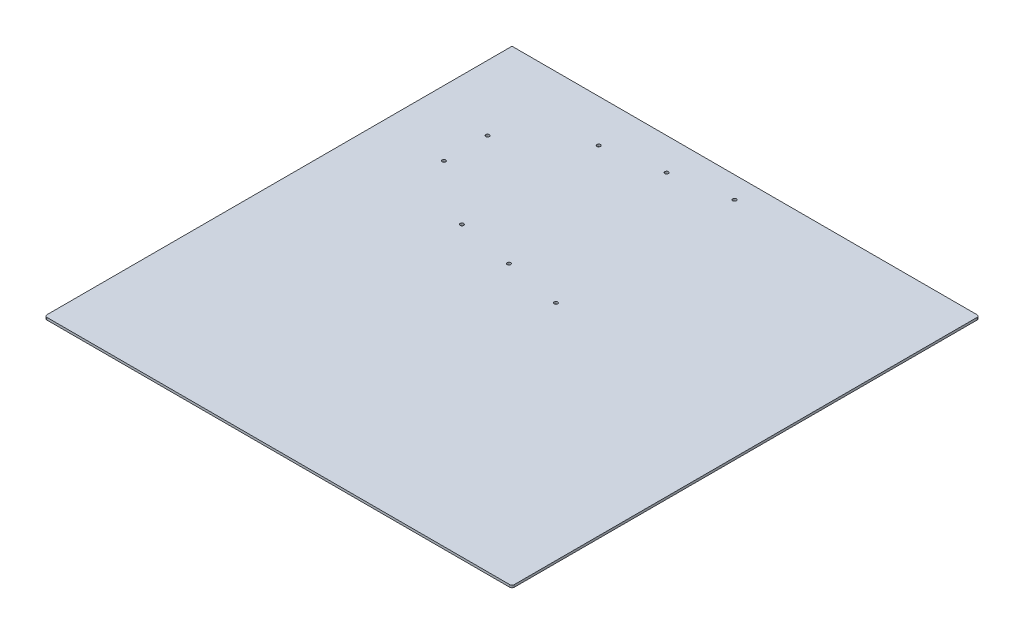
ISO-10303-21;
HEADER;
FILE_DESCRIPTION(('STEP AP214'),'2;1');
FILE_NAME('part.step','',(''),(''),'','','');
FILE_SCHEMA(('AUTOMOTIVE_DESIGN { 1 0 10303 214 1 1 1 1 }'));
ENDSEC;
DATA;
#1=APPLICATION_CONTEXT('core data for automotive mechanical design processes');
#2=APPLICATION_PROTOCOL_DEFINITION('international standard','automotive_design',2000,#1);
#3=PRODUCT_CONTEXT('',#1,'mechanical');
#4=PRODUCT('Part','Part','',(#3));
#5=PRODUCT_RELATED_PRODUCT_CATEGORY('part','',(#4));
#6=PRODUCT_DEFINITION_FORMATION('','',#4);
#7=PRODUCT_DEFINITION_CONTEXT('part definition',#1,'design');
#8=PRODUCT_DEFINITION('design','',#6,#7);
#9=PRODUCT_DEFINITION_SHAPE('','',#8);
#10=(LENGTH_UNIT() NAMED_UNIT(*) SI_UNIT(.MILLI.,.METRE.));
#11=(NAMED_UNIT(*) PLANE_ANGLE_UNIT() SI_UNIT($,.RADIAN.));
#12=(NAMED_UNIT(*) SI_UNIT($,.STERADIAN.) SOLID_ANGLE_UNIT());
#13=UNCERTAINTY_MEASURE_WITH_UNIT(LENGTH_MEASURE(1.E-05),#10,'distance_accuracy_value','');
#14=(GEOMETRIC_REPRESENTATION_CONTEXT(3) GLOBAL_UNCERTAINTY_ASSIGNED_CONTEXT((#13)) GLOBAL_UNIT_ASSIGNED_CONTEXT((#10,
#11,#12)) REPRESENTATION_CONTEXT('',''));
#15=CARTESIAN_POINT('',(0.,0.,0.));
#16=DIRECTION('',(0.,0.,1.));
#17=DIRECTION('',(1.,0.,0.));
#18=AXIS2_PLACEMENT_3D('',#15,#16,#17);
#19=CARTESIAN_POINT('',(0.,0.,0.));
#20=DIRECTION('',(0.,1.,0.));
#21=DIRECTION('',(1.,0.,0.));
#22=AXIS2_PLACEMENT_3D('',#19,#20,#21);
#23=PLANE('',#22);
#24=CARTESIAN_POINT('',(-40.1473556261201,0.,-37.5240841158934));
#25=DIRECTION('',(0.,1.,0.));
#26=DIRECTION('',(1.,0.,0.));
#27=AXIS2_PLACEMENT_3D('',#24,#25,#26);
#28=CIRCLE('',#27,1.5);
#29=CARTESIAN_POINT('',(-41.6473556261201,0.,-37.5240841158934));
#30=VERTEX_POINT('',#29);
#31=EDGE_CURVE('E21',#30,#30,#28,.T.);
#32=ORIENTED_EDGE('',*,*,#31,.T.);
#33=EDGE_LOOP('',(#32));
#34=FACE_BOUND('',#33,.T.);
#35=CARTESIAN_POINT('',(-144.179839264374,0.,-123.344131154265));
#36=DIRECTION('',(0.,1.,0.));
#37=DIRECTION('',(1.,0.,0.));
#38=AXIS2_PLACEMENT_3D('',#35,#36,#37);
#39=CIRCLE('',#38,1.5);
#40=CARTESIAN_POINT('',(-145.679839264374,0.,-123.344131154265));
#41=VERTEX_POINT('',#40);
#42=EDGE_CURVE('E228',#41,#41,#39,.T.);
#43=ORIENTED_EDGE('',*,*,#42,.T.);
#44=EDGE_LOOP('',(#43));
#45=FACE_BOUND('',#44,.T.);
#46=CARTESIAN_POINT('',(-89.3419163550637,0.,-163.537504689386));
#47=DIRECTION('',(0.,1.,0.));
#48=DIRECTION('',(1.,0.,0.));
#49=AXIS2_PLACEMENT_3D('',#46,#47,#48);
#50=CIRCLE('',#49,1.5);
#51=CARTESIAN_POINT('',(-90.8419163550637,0.,-163.537504689386));
#52=VERTEX_POINT('',#51);
#53=EDGE_CURVE('E273',#52,#52,#50,.T.);
#54=ORIENTED_EDGE('',*,*,#53,.T.);
#55=EDGE_LOOP('',(#54));
#56=FACE_BOUND('',#55,.T.);
#57=CARTESIAN_POINT('',(-144.179839264374,0.,-85.8946819714881));
#58=DIRECTION('',(0.,1.,0.));
#59=DIRECTION('',(1.,0.,0.));
#60=AXIS2_PLACEMENT_3D('',#57,#58,#59);
#61=CIRCLE('',#60,1.5);
#62=CARTESIAN_POINT('',(-145.679839264374,0.,-85.8946819714881));
#63=VERTEX_POINT('',#62);
#64=EDGE_CURVE('E191',#63,#63,#61,.T.);
#65=ORIENTED_EDGE('',*,*,#64,.T.);
#66=EDGE_LOOP('',(#65));
#67=FACE_BOUND('',#66,.T.);
#68=CARTESIAN_POINT('',(9.04720510282539,0.,-28.5856729211623));
#69=DIRECTION('',(0.,1.,0.));
#70=DIRECTION('',(1.,0.,0.));
#71=AXIS2_PLACEMENT_3D('',#68,#69,#70);
#72=CIRCLE('',#71,1.5);
#73=CARTESIAN_POINT('',(7.54720510282541,0.,-28.5856729211623));
#74=VERTEX_POINT('',#73);
#75=EDGE_CURVE('E197',#74,#74,#72,.T.);
#76=ORIENTED_EDGE('',*,*,#75,.T.);
#77=EDGE_LOOP('',(#76));
#78=FACE_BOUND('',#77,.T.);
#79=CARTESIAN_POINT('',(-40.1473556261179,0.,-172.475915884116));
#80=DIRECTION('',(0.,1.,0.));
#81=DIRECTION('',(1.,0.,0.));
#82=AXIS2_PLACEMENT_3D('',#79,#80,#81);
#83=CIRCLE('',#82,1.5);
#84=CARTESIAN_POINT('',(-41.6473556261179,0.,-172.475915884116));
#85=VERTEX_POINT('',#84);
#86=EDGE_CURVE('E227',#85,#85,#83,.T.);
#87=ORIENTED_EDGE('',*,*,#86,.T.);
#88=EDGE_LOOP('',(#87));
#89=FACE_BOUND('',#88,.T.);
#90=CARTESIAN_POINT('',(9.04720510282782,0.,-181.414327078845));
#91=DIRECTION('',(0.,1.,0.));
#92=DIRECTION('',(1.,0.,0.));
#93=AXIS2_PLACEMENT_3D('',#90,#91,#92);
#94=CIRCLE('',#93,1.5);
#95=CARTESIAN_POINT('',(7.54720510282784,0.,-181.414327078845));
#96=VERTEX_POINT('',#95);
#97=EDGE_CURVE('E152',#96,#96,#94,.T.);
#98=ORIENTED_EDGE('',*,*,#97,.T.);
#99=EDGE_LOOP('',(#98));
#100=FACE_BOUND('',#99,.T.);
#101=CARTESIAN_POINT('',(-89.3419163550656,0.,-46.4624953106245));
#102=DIRECTION('',(0.,1.,0.));
#103=DIRECTION('',(1.,0.,0.));
#104=AXIS2_PLACEMENT_3D('',#101,#102,#103);
#105=CIRCLE('',#104,1.5);
#106=CARTESIAN_POINT('',(-90.8419163550655,0.,-46.4624953106245));
#107=VERTEX_POINT('',#106);
#108=EDGE_CURVE('E223',#107,#107,#105,.T.);
#109=ORIENTED_EDGE('',*,*,#108,.T.);
#110=EDGE_LOOP('',(#109));
#111=FACE_BOUND('',#110,.T.);
#112=CARTESIAN_POINT('',(198.,0.,198.));
#113=DIRECTION('',(0.,1.,0.));
#114=DIRECTION('',(0.,0.,1.));
#115=AXIS2_PLACEMENT_3D('',#112,#113,#114);
#116=CIRCLE('',#115,2.);
#117=CARTESIAN_POINT('',(198.,0.,200.));
#118=VERTEX_POINT('',#117);
#119=CARTESIAN_POINT('',(200.,0.,198.));
#120=VERTEX_POINT('',#119);
#121=EDGE_CURVE('E28',#118,#120,#116,.T.);
#122=ORIENTED_EDGE('',*,*,#121,.F.);
#123=DIRECTION('',(1.,0.,0.));
#124=VECTOR('',#123,1.);
#125=CARTESIAN_POINT('',(-198.,0.,200.));
#126=LINE('',#125,#124);
#127=CARTESIAN_POINT('',(-198.,0.,200.));
#128=VERTEX_POINT('',#127);
#129=EDGE_CURVE('E298',#128,#118,#126,.T.);
#130=ORIENTED_EDGE('',*,*,#129,.F.);
#131=CARTESIAN_POINT('',(-198.,0.,198.));
#132=DIRECTION('',(0.,1.,0.));
#133=DIRECTION('',(-1.,0.,0.));
#134=AXIS2_PLACEMENT_3D('',#131,#132,#133);
#135=CIRCLE('',#134,2.00000000000006);
#136=CARTESIAN_POINT('',(-200.,0.,198.));
#137=VERTEX_POINT('',#136);
#138=EDGE_CURVE('E204',#137,#128,#135,.T.);
#139=ORIENTED_EDGE('',*,*,#138,.F.);
#140=DIRECTION('',(0.,0.,1.));
#141=VECTOR('',#140,1.);
#142=CARTESIAN_POINT('',(-200.,0.,-200.));
#143=LINE('',#142,#141);
#144=CARTESIAN_POINT('',(-200.,0.,-200.));
#145=VERTEX_POINT('',#144);
#146=EDGE_CURVE('E201',#145,#137,#143,.T.);
#147=ORIENTED_EDGE('',*,*,#146,.F.);
#148=DIRECTION('',(-1.,0.,0.));
#149=VECTOR('',#148,1.);
#150=CARTESIAN_POINT('',(198.,0.,-200.));
#151=LINE('',#150,#149);
#152=CARTESIAN_POINT('',(198.,0.,-200.));
#153=VERTEX_POINT('',#152);
#154=EDGE_CURVE('E239',#153,#145,#151,.T.);
#155=ORIENTED_EDGE('',*,*,#154,.F.);
#156=CARTESIAN_POINT('',(198.,0.,-198.));
#157=DIRECTION('',(0.,1.,0.));
#158=DIRECTION('',(1.,0.,0.));
#159=AXIS2_PLACEMENT_3D('',#156,#157,#158);
#160=CIRCLE('',#159,2.);
#161=CARTESIAN_POINT('',(200.,0.,-198.));
#162=VERTEX_POINT('',#161);
#163=EDGE_CURVE('E186',#162,#153,#160,.T.);
#164=ORIENTED_EDGE('',*,*,#163,.F.);
#165=DIRECTION('',(0.,0.,-1.));
#166=VECTOR('',#165,1.);
#167=CARTESIAN_POINT('',(200.,0.,198.));
#168=LINE('',#167,#166);
#169=EDGE_CURVE('E178',#120,#162,#168,.T.);
#170=ORIENTED_EDGE('',*,*,#169,.F.);
#171=EDGE_LOOP('',(#122,#130,#139,#147,#155,#164,#170));
#172=FACE_BOUND('',#171,.T.);
#173=ADVANCED_FACE('F17',(#34,#45,#56,#67,#78,#89,#100,#111,#172),#23,.F.);
#174=CARTESIAN_POINT('',(0.,2.,0.));
#175=DIRECTION('',(0.,1.,0.));
#176=DIRECTION('',(1.,0.,0.));
#177=AXIS2_PLACEMENT_3D('',#174,#175,#176);
#178=PLANE('',#177);
#179=CARTESIAN_POINT('',(-40.1473556261201,2.,-37.5240841158934));
#180=DIRECTION('',(0.,-1.,0.));
#181=DIRECTION('',(1.,0.,0.));
#182=AXIS2_PLACEMENT_3D('',#179,#180,#181);
#183=CIRCLE('',#182,1.5);
#184=CARTESIAN_POINT('',(-41.6473556261201,2.,-37.5240841158934));
#185=VERTEX_POINT('',#184);
#186=EDGE_CURVE('E231',#185,#185,#183,.T.);
#187=ORIENTED_EDGE('',*,*,#186,.T.);
#188=EDGE_LOOP('',(#187));
#189=FACE_BOUND('',#188,.T.);
#190=CARTESIAN_POINT('',(-144.179839264374,2.,-123.344131154265));
#191=DIRECTION('',(0.,-1.,0.));
#192=DIRECTION('',(1.,0.,0.));
#193=AXIS2_PLACEMENT_3D('',#190,#191,#192);
#194=CIRCLE('',#193,1.5);
#195=CARTESIAN_POINT('',(-145.679839264374,2.,-123.344131154265));
#196=VERTEX_POINT('',#195);
#197=EDGE_CURVE('E261',#196,#196,#194,.T.);
#198=ORIENTED_EDGE('',*,*,#197,.T.);
#199=EDGE_LOOP('',(#198));
#200=FACE_BOUND('',#199,.T.);
#201=CARTESIAN_POINT('',(-89.3419163550637,2.,-163.537504689386));
#202=DIRECTION('',(0.,-1.,0.));
#203=DIRECTION('',(1.,0.,0.));
#204=AXIS2_PLACEMENT_3D('',#201,#202,#203);
#205=CIRCLE('',#204,1.5);
#206=CARTESIAN_POINT('',(-90.8419163550637,2.,-163.537504689386));
#207=VERTEX_POINT('',#206);
#208=EDGE_CURVE('E187',#207,#207,#205,.T.);
#209=ORIENTED_EDGE('',*,*,#208,.T.);
#210=EDGE_LOOP('',(#209));
#211=FACE_BOUND('',#210,.T.);
#212=CARTESIAN_POINT('',(-144.179839264374,2.,-85.8946819714881));
#213=DIRECTION('',(0.,-1.,0.));
#214=DIRECTION('',(1.,0.,0.));
#215=AXIS2_PLACEMENT_3D('',#212,#213,#214);
#216=CIRCLE('',#215,1.5);
#217=CARTESIAN_POINT('',(-145.679839264374,2.,-85.8946819714881));
#218=VERTEX_POINT('',#217);
#219=EDGE_CURVE('E192',#218,#218,#216,.T.);
#220=ORIENTED_EDGE('',*,*,#219,.T.);
#221=EDGE_LOOP('',(#220));
#222=FACE_BOUND('',#221,.T.);
#223=CARTESIAN_POINT('',(9.04720510282539,2.,-28.5856729211623));
#224=DIRECTION('',(0.,-1.,0.));
#225=DIRECTION('',(1.,0.,0.));
#226=AXIS2_PLACEMENT_3D('',#223,#224,#225);
#227=CIRCLE('',#226,1.5);
#228=CARTESIAN_POINT('',(7.54720510282541,2.,-28.5856729211623));
#229=VERTEX_POINT('',#228);
#230=EDGE_CURVE('E258',#229,#229,#227,.T.);
#231=ORIENTED_EDGE('',*,*,#230,.T.);
#232=EDGE_LOOP('',(#231));
#233=FACE_BOUND('',#232,.T.);
#234=CARTESIAN_POINT('',(-40.1473556261179,2.,-172.475915884116));
#235=DIRECTION('',(0.,-1.,0.));
#236=DIRECTION('',(1.,0.,0.));
#237=AXIS2_PLACEMENT_3D('',#234,#235,#236);
#238=CIRCLE('',#237,1.5);
#239=CARTESIAN_POINT('',(-41.6473556261179,2.,-172.475915884116));
#240=VERTEX_POINT('',#239);
#241=EDGE_CURVE('E157',#240,#240,#238,.T.);
#242=ORIENTED_EDGE('',*,*,#241,.T.);
#243=EDGE_LOOP('',(#242));
#244=FACE_BOUND('',#243,.T.);
#245=CARTESIAN_POINT('',(9.04720510282782,2.,-181.414327078845));
#246=DIRECTION('',(0.,-1.,0.));
#247=DIRECTION('',(1.,0.,0.));
#248=AXIS2_PLACEMENT_3D('',#245,#246,#247);
#249=CIRCLE('',#248,1.5);
#250=CARTESIAN_POINT('',(7.54720510282784,2.,-181.414327078845));
#251=VERTEX_POINT('',#250);
#252=EDGE_CURVE('E167',#251,#251,#249,.T.);
#253=ORIENTED_EDGE('',*,*,#252,.T.);
#254=EDGE_LOOP('',(#253));
#255=FACE_BOUND('',#254,.T.);
#256=CARTESIAN_POINT('',(-89.3419163550656,2.,-46.4624953106245));
#257=DIRECTION('',(0.,-1.,0.));
#258=DIRECTION('',(1.,0.,0.));
#259=AXIS2_PLACEMENT_3D('',#256,#257,#258);
#260=CIRCLE('',#259,1.5);
#261=CARTESIAN_POINT('',(-90.8419163550655,2.,-46.4624953106245));
#262=VERTEX_POINT('',#261);
#263=EDGE_CURVE('E215',#262,#262,#260,.T.);
#264=ORIENTED_EDGE('',*,*,#263,.T.);
#265=EDGE_LOOP('',(#264));
#266=FACE_BOUND('',#265,.T.);
#267=CARTESIAN_POINT('',(198.,2.,198.));
#268=DIRECTION('',(0.,1.,0.));
#269=DIRECTION('',(0.,0.,1.));
#270=AXIS2_PLACEMENT_3D('',#267,#268,#269);
#271=CIRCLE('',#270,2.);
#272=CARTESIAN_POINT('',(198.,2.,200.));
#273=VERTEX_POINT('',#272);
#274=CARTESIAN_POINT('',(200.,2.,198.));
#275=VERTEX_POINT('',#274);
#276=EDGE_CURVE('E11',#273,#275,#271,.T.);
#277=ORIENTED_EDGE('',*,*,#276,.T.);
#278=DIRECTION('',(0.,0.,-1.));
#279=VECTOR('',#278,1.);
#280=CARTESIAN_POINT('',(200.,2.,198.));
#281=LINE('',#280,#279);
#282=CARTESIAN_POINT('',(200.,2.,-198.));
#283=VERTEX_POINT('',#282);
#284=EDGE_CURVE('E181',#275,#283,#281,.T.);
#285=ORIENTED_EDGE('',*,*,#284,.T.);
#286=CARTESIAN_POINT('',(198.,2.,-198.));
#287=DIRECTION('',(0.,1.,0.));
#288=DIRECTION('',(1.,0.,0.));
#289=AXIS2_PLACEMENT_3D('',#286,#287,#288);
#290=CIRCLE('',#289,2.);
#291=CARTESIAN_POINT('',(198.,2.,-200.));
#292=VERTEX_POINT('',#291);
#293=EDGE_CURVE('E183',#283,#292,#290,.T.);
#294=ORIENTED_EDGE('',*,*,#293,.T.);
#295=DIRECTION('',(-1.,0.,0.));
#296=VECTOR('',#295,1.);
#297=CARTESIAN_POINT('',(198.,2.,-200.));
#298=LINE('',#297,#296);
#299=CARTESIAN_POINT('',(-200.,2.,-200.));
#300=VERTEX_POINT('',#299);
#301=EDGE_CURVE('E214',#292,#300,#298,.T.);
#302=ORIENTED_EDGE('',*,*,#301,.T.);
#303=DIRECTION('',(0.,0.,1.));
#304=VECTOR('',#303,1.);
#305=CARTESIAN_POINT('',(-200.,2.,-200.));
#306=LINE('',#305,#304);
#307=CARTESIAN_POINT('',(-200.,2.,198.));
#308=VERTEX_POINT('',#307);
#309=EDGE_CURVE('E209',#300,#308,#306,.T.);
#310=ORIENTED_EDGE('',*,*,#309,.T.);
#311=CARTESIAN_POINT('',(-198.,2.,198.));
#312=DIRECTION('',(0.,1.,0.));
#313=DIRECTION('',(-1.,0.,0.));
#314=AXIS2_PLACEMENT_3D('',#311,#312,#313);
#315=CIRCLE('',#314,2.00000000000006);
#316=CARTESIAN_POINT('',(-198.,2.,200.));
#317=VERTEX_POINT('',#316);
#318=EDGE_CURVE('E202',#308,#317,#315,.T.);
#319=ORIENTED_EDGE('',*,*,#318,.T.);
#320=DIRECTION('',(1.,0.,0.));
#321=VECTOR('',#320,1.);
#322=CARTESIAN_POINT('',(-198.,2.,200.));
#323=LINE('',#322,#321);
#324=EDGE_CURVE('E173',#317,#273,#323,.T.);
#325=ORIENTED_EDGE('',*,*,#324,.T.);
#326=EDGE_LOOP('',(#277,#285,#294,#302,#310,#319,#325));
#327=FACE_BOUND('',#326,.T.);
#328=ADVANCED_FACE('F284',(#189,#200,#211,#222,#233,#244,#255,#266,#327),#178,.T.);
#329=CARTESIAN_POINT('',(198.,0.,198.));
#330=DIRECTION('',(0.,1.,0.));
#331=DIRECTION('',(0.,0.,1.));
#332=AXIS2_PLACEMENT_3D('',#329,#330,#331);
#333=CYLINDRICAL_SURFACE('',#332,2.);
#334=ORIENTED_EDGE('',*,*,#121,.T.);
#335=DIRECTION('',(0.,1.,0.));
#336=VECTOR('',#335,1.);
#337=CARTESIAN_POINT('',(200.,0.,198.));
#338=LINE('',#337,#336);
#339=EDGE_CURVE('E233',#120,#275,#338,.T.);
#340=ORIENTED_EDGE('',*,*,#339,.T.);
#341=ORIENTED_EDGE('',*,*,#276,.F.);
#342=DIRECTION('',(0.,1.,0.));
#343=VECTOR('',#342,1.);
#344=CARTESIAN_POINT('',(198.,0.,200.));
#345=LINE('',#344,#343);
#346=EDGE_CURVE('E177',#118,#273,#345,.T.);
#347=ORIENTED_EDGE('',*,*,#346,.F.);
#348=EDGE_LOOP('',(#334,#340,#341,#347));
#349=FACE_BOUND('',#348,.T.);
#350=ADVANCED_FACE('F512',(#349),#333,.T.);
#351=CARTESIAN_POINT('',(200.,0.,198.));
#352=DIRECTION('',(1.,0.,0.));
#353=DIRECTION('',(0.,0.,-1.));
#354=AXIS2_PLACEMENT_3D('',#351,#352,#353);
#355=PLANE('',#354);
#356=ORIENTED_EDGE('',*,*,#169,.T.);
#357=DIRECTION('',(0.,1.,0.));
#358=VECTOR('',#357,1.);
#359=CARTESIAN_POINT('',(200.,0.,-198.));
#360=LINE('',#359,#358);
#361=EDGE_CURVE('E182',#162,#283,#360,.T.);
#362=ORIENTED_EDGE('',*,*,#361,.T.);
#363=ORIENTED_EDGE('',*,*,#284,.F.);
#364=ORIENTED_EDGE('',*,*,#339,.F.);
#365=EDGE_LOOP('',(#356,#362,#363,#364));
#366=FACE_BOUND('',#365,.T.);
#367=ADVANCED_FACE('F320',(#366),#355,.T.);
#368=CARTESIAN_POINT('',(198.,0.,-198.));
#369=DIRECTION('',(0.,1.,0.));
#370=DIRECTION('',(1.,0.,0.));
#371=AXIS2_PLACEMENT_3D('',#368,#369,#370);
#372=CYLINDRICAL_SURFACE('',#371,2.);
#373=ORIENTED_EDGE('',*,*,#163,.T.);
#374=DIRECTION('',(0.,1.,0.));
#375=VECTOR('',#374,1.);
#376=CARTESIAN_POINT('',(198.,0.,-200.));
#377=LINE('',#376,#375);
#378=EDGE_CURVE('E210',#153,#292,#377,.T.);
#379=ORIENTED_EDGE('',*,*,#378,.T.);
#380=ORIENTED_EDGE('',*,*,#293,.F.);
#381=ORIENTED_EDGE('',*,*,#361,.F.);
#382=EDGE_LOOP('',(#373,#379,#380,#381));
#383=FACE_BOUND('',#382,.T.);
#384=ADVANCED_FACE('F326',(#383),#372,.T.);
#385=CARTESIAN_POINT('',(198.,0.,-200.));
#386=DIRECTION('',(0.,0.,-1.));
#387=DIRECTION('',(0.,-1.,0.));
#388=AXIS2_PLACEMENT_3D('',#385,#386,#387);
#389=PLANE('',#388);
#390=ORIENTED_EDGE('',*,*,#154,.T.);
#391=DIRECTION('',(0.,1.,0.));
#392=VECTOR('',#391,1.);
#393=CARTESIAN_POINT('',(-200.,0.,-200.));
#394=LINE('',#393,#392);
#395=EDGE_CURVE('E236',#145,#300,#394,.T.);
#396=ORIENTED_EDGE('',*,*,#395,.T.);
#397=ORIENTED_EDGE('',*,*,#301,.F.);
#398=ORIENTED_EDGE('',*,*,#378,.F.);
#399=EDGE_LOOP('',(#390,#396,#397,#398));
#400=FACE_BOUND('',#399,.T.);
#401=ADVANCED_FACE('F329',(#400),#389,.T.);
#402=CARTESIAN_POINT('',(-200.,0.,-200.));
#403=DIRECTION('',(-1.,0.,0.));
#404=DIRECTION('',(0.,1.,0.));
#405=AXIS2_PLACEMENT_3D('',#402,#403,#404);
#406=PLANE('',#405);
#407=ORIENTED_EDGE('',*,*,#146,.T.);
#408=DIRECTION('',(0.,1.,0.));
#409=VECTOR('',#408,1.);
#410=CARTESIAN_POINT('',(-200.,0.,198.));
#411=LINE('',#410,#409);
#412=EDGE_CURVE('E198',#137,#308,#411,.T.);
#413=ORIENTED_EDGE('',*,*,#412,.T.);
#414=ORIENTED_EDGE('',*,*,#309,.F.);
#415=ORIENTED_EDGE('',*,*,#395,.F.);
#416=EDGE_LOOP('',(#407,#413,#414,#415));
#417=FACE_BOUND('',#416,.T.);
#418=ADVANCED_FACE('F533',(#417),#406,.T.);
#419=CARTESIAN_POINT('',(-198.,0.,198.));
#420=DIRECTION('',(0.,1.,0.));
#421=DIRECTION('',(-1.,0.,0.));
#422=AXIS2_PLACEMENT_3D('',#419,#420,#421);
#423=CYLINDRICAL_SURFACE('',#422,2.00000000000006);
#424=ORIENTED_EDGE('',*,*,#138,.T.);
#425=DIRECTION('',(0.,1.,0.));
#426=VECTOR('',#425,1.);
#427=CARTESIAN_POINT('',(-198.,0.,200.));
#428=LINE('',#427,#426);
#429=EDGE_CURVE('E176',#128,#317,#428,.T.);
#430=ORIENTED_EDGE('',*,*,#429,.T.);
#431=ORIENTED_EDGE('',*,*,#318,.F.);
#432=ORIENTED_EDGE('',*,*,#412,.F.);
#433=EDGE_LOOP('',(#424,#430,#431,#432));
#434=FACE_BOUND('',#433,.T.);
#435=ADVANCED_FACE('F290',(#434),#423,.T.);
#436=CARTESIAN_POINT('',(-198.,0.,200.));
#437=DIRECTION('',(0.,0.,1.));
#438=DIRECTION('',(1.,0.,0.));
#439=AXIS2_PLACEMENT_3D('',#436,#437,#438);
#440=PLANE('',#439);
#441=ORIENTED_EDGE('',*,*,#129,.T.);
#442=ORIENTED_EDGE('',*,*,#346,.T.);
#443=ORIENTED_EDGE('',*,*,#324,.F.);
#444=ORIENTED_EDGE('',*,*,#429,.F.);
#445=EDGE_LOOP('',(#441,#442,#443,#444));
#446=FACE_BOUND('',#445,.T.);
#447=ADVANCED_FACE('F19',(#446),#440,.T.);
#448=CARTESIAN_POINT('',(-40.1473556261201,2.,-37.5240841158934));
#449=DIRECTION('',(0.,-1.,0.));
#450=DIRECTION('',(1.,0.,0.));
#451=AXIS2_PLACEMENT_3D('',#448,#449,#450);
#452=CYLINDRICAL_SURFACE('',#451,1.5);
#453=ORIENTED_EDGE('',*,*,#186,.F.);
#454=DIRECTION('',(0.,-1.,0.));
#455=VECTOR('',#454,1.);
#456=CARTESIAN_POINT('',(-41.6473556261201,2.,-37.5240841158934));
#457=LINE('',#456,#455);
#458=EDGE_CURVE('E277',#185,#30,#457,.T.);
#459=ORIENTED_EDGE('',*,*,#458,.T.);
#460=ORIENTED_EDGE('',*,*,#31,.F.);
#461=ORIENTED_EDGE('',*,*,#458,.F.);
#462=EDGE_LOOP('',(#453,#459,#460,#461));
#463=FACE_BOUND('',#462,.T.);
#464=ADVANCED_FACE('F531',(#463),#452,.F.);
#465=CARTESIAN_POINT('',(-144.179839264374,2.,-123.344131154265));
#466=DIRECTION('',(0.,-1.,0.));
#467=DIRECTION('',(1.,0.,0.));
#468=AXIS2_PLACEMENT_3D('',#465,#466,#467);
#469=CYLINDRICAL_SURFACE('',#468,1.5);
#470=ORIENTED_EDGE('',*,*,#197,.F.);
#471=DIRECTION('',(0.,-1.,0.));
#472=VECTOR('',#471,1.);
#473=CARTESIAN_POINT('',(-145.679839264374,2.,-123.344131154265));
#474=LINE('',#473,#472);
#475=EDGE_CURVE('E232',#196,#41,#474,.T.);
#476=ORIENTED_EDGE('',*,*,#475,.T.);
#477=ORIENTED_EDGE('',*,*,#42,.F.);
#478=ORIENTED_EDGE('',*,*,#475,.F.);
#479=EDGE_LOOP('',(#470,#476,#477,#478));
#480=FACE_BOUND('',#479,.T.);
#481=ADVANCED_FACE('F528',(#480),#469,.F.);
#482=CARTESIAN_POINT('',(-89.3419163550637,2.,-163.537504689386));
#483=DIRECTION('',(0.,-1.,0.));
#484=DIRECTION('',(1.,0.,0.));
#485=AXIS2_PLACEMENT_3D('',#482,#483,#484);
#486=CYLINDRICAL_SURFACE('',#485,1.5);
#487=ORIENTED_EDGE('',*,*,#208,.F.);
#488=DIRECTION('',(0.,-1.,0.));
#489=VECTOR('',#488,1.);
#490=CARTESIAN_POINT('',(-90.8419163550637,2.,-163.537504689386));
#491=LINE('',#490,#489);
#492=EDGE_CURVE('E171',#207,#52,#491,.T.);
#493=ORIENTED_EDGE('',*,*,#492,.T.);
#494=ORIENTED_EDGE('',*,*,#53,.F.);
#495=ORIENTED_EDGE('',*,*,#492,.F.);
#496=EDGE_LOOP('',(#487,#493,#494,#495));
#497=FACE_BOUND('',#496,.T.);
#498=ADVANCED_FACE('F526',(#497),#486,.F.);
#499=CARTESIAN_POINT('',(-144.179839264374,2.,-85.8946819714881));
#500=DIRECTION('',(0.,-1.,0.));
#501=DIRECTION('',(1.,0.,0.));
#502=AXIS2_PLACEMENT_3D('',#499,#500,#501);
#503=CYLINDRICAL_SURFACE('',#502,1.5);
#504=ORIENTED_EDGE('',*,*,#219,.F.);
#505=DIRECTION('',(0.,-1.,0.));
#506=VECTOR('',#505,1.);
#507=CARTESIAN_POINT('',(-145.679839264374,2.,-85.8946819714881));
#508=LINE('',#507,#506);
#509=EDGE_CURVE('E196',#218,#63,#508,.T.);
#510=ORIENTED_EDGE('',*,*,#509,.T.);
#511=ORIENTED_EDGE('',*,*,#64,.F.);
#512=ORIENTED_EDGE('',*,*,#509,.F.);
#513=EDGE_LOOP('',(#504,#510,#511,#512));
#514=FACE_BOUND('',#513,.T.);
#515=ADVANCED_FACE('F540',(#514),#503,.F.);
#516=CARTESIAN_POINT('',(9.04720510282539,2.,-28.5856729211623));
#517=DIRECTION('',(0.,-1.,0.));
#518=DIRECTION('',(1.,0.,0.));
#519=AXIS2_PLACEMENT_3D('',#516,#517,#518);
#520=CYLINDRICAL_SURFACE('',#519,1.5);
#521=ORIENTED_EDGE('',*,*,#230,.F.);
#522=DIRECTION('',(0.,-1.,0.));
#523=VECTOR('',#522,1.);
#524=CARTESIAN_POINT('',(7.54720510282541,2.,-28.5856729211623));
#525=LINE('',#524,#523);
#526=EDGE_CURVE('E263',#229,#74,#525,.T.);
#527=ORIENTED_EDGE('',*,*,#526,.T.);
#528=ORIENTED_EDGE('',*,*,#75,.F.);
#529=ORIENTED_EDGE('',*,*,#526,.F.);
#530=EDGE_LOOP('',(#521,#527,#528,#529));
#531=FACE_BOUND('',#530,.T.);
#532=ADVANCED_FACE('F542',(#531),#520,.F.);
#533=CARTESIAN_POINT('',(-40.1473556261179,2.,-172.475915884116));
#534=DIRECTION('',(0.,-1.,0.));
#535=DIRECTION('',(1.,0.,0.));
#536=AXIS2_PLACEMENT_3D('',#533,#534,#535);
#537=CYLINDRICAL_SURFACE('',#536,1.5);
#538=ORIENTED_EDGE('',*,*,#241,.F.);
#539=DIRECTION('',(0.,-1.,0.));
#540=VECTOR('',#539,1.);
#541=CARTESIAN_POINT('',(-41.6473556261179,2.,-172.475915884116));
#542=LINE('',#541,#540);
#543=EDGE_CURVE('E165',#240,#85,#542,.T.);
#544=ORIENTED_EDGE('',*,*,#543,.T.);
#545=ORIENTED_EDGE('',*,*,#86,.F.);
#546=ORIENTED_EDGE('',*,*,#543,.F.);
#547=EDGE_LOOP('',(#538,#544,#545,#546));
#548=FACE_BOUND('',#547,.T.);
#549=ADVANCED_FACE('F565',(#548),#537,.F.);
#550=CARTESIAN_POINT('',(9.04720510282782,2.,-181.414327078845));
#551=DIRECTION('',(0.,-1.,0.));
#552=DIRECTION('',(1.,0.,0.));
#553=AXIS2_PLACEMENT_3D('',#550,#551,#552);
#554=CYLINDRICAL_SURFACE('',#553,1.5);
#555=ORIENTED_EDGE('',*,*,#252,.F.);
#556=DIRECTION('',(0.,-1.,0.));
#557=VECTOR('',#556,1.);
#558=CARTESIAN_POINT('',(7.54720510282784,2.,-181.414327078845));
#559=LINE('',#558,#557);
#560=EDGE_CURVE('E158',#251,#96,#559,.T.);
#561=ORIENTED_EDGE('',*,*,#560,.T.);
#562=ORIENTED_EDGE('',*,*,#97,.F.);
#563=ORIENTED_EDGE('',*,*,#560,.F.);
#564=EDGE_LOOP('',(#555,#561,#562,#563));
#565=FACE_BOUND('',#564,.T.);
#566=ADVANCED_FACE('F539',(#565),#554,.F.);
#567=CARTESIAN_POINT('',(-89.3419163550656,2.,-46.4624953106245));
#568=DIRECTION('',(0.,-1.,0.));
#569=DIRECTION('',(1.,0.,0.));
#570=AXIS2_PLACEMENT_3D('',#567,#568,#569);
#571=CYLINDRICAL_SURFACE('',#570,1.5);
#572=ORIENTED_EDGE('',*,*,#263,.F.);
#573=DIRECTION('',(0.,-1.,0.));
#574=VECTOR('',#573,1.);
#575=CARTESIAN_POINT('',(-90.8419163550655,2.,-46.4624953106245));
#576=LINE('',#575,#574);
#577=EDGE_CURVE('E219',#262,#107,#576,.T.);
#578=ORIENTED_EDGE('',*,*,#577,.T.);
#579=ORIENTED_EDGE('',*,*,#108,.F.);
#580=ORIENTED_EDGE('',*,*,#577,.F.);
#581=EDGE_LOOP('',(#572,#578,#579,#580));
#582=FACE_BOUND('',#581,.T.);
#583=ADVANCED_FACE('F509',(#582),#571,.F.);
#584=CLOSED_SHELL('',(#173,#328,#350,#367,#384,#401,#418,#435,#447,#464,#481,#498,#515,#532,
#549,#566,#583));
#585=MANIFOLD_SOLID_BREP('B1',#584);
#586=ADVANCED_BREP_SHAPE_REPRESENTATION('',(#18,#585),#14);
#587=SHAPE_DEFINITION_REPRESENTATION(#9,#586);
ENDSEC;
END-ISO-10303-21;
